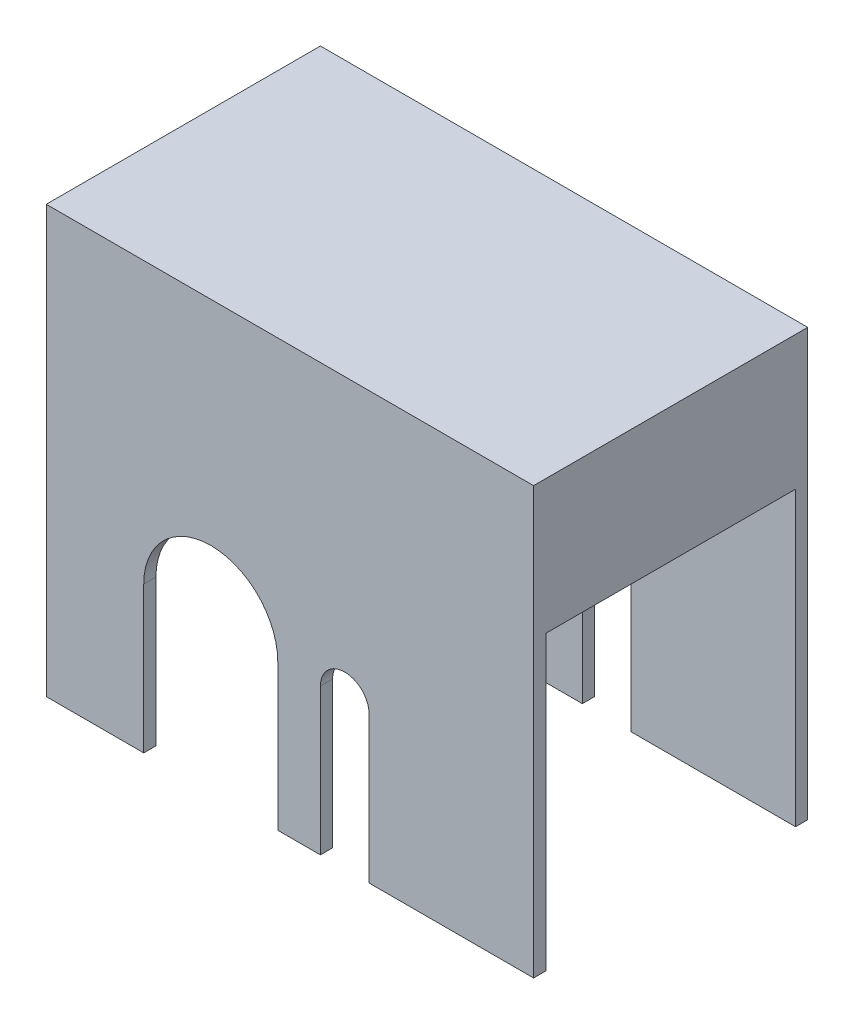
ISO-10303-21;
HEADER;
FILE_DESCRIPTION(('STEP AP214'),'2;1');
FILE_NAME('part.step','',(''),(''),'','','');
FILE_SCHEMA(('AUTOMOTIVE_DESIGN { 1 0 10303 214 1 1 1 1 }'));
ENDSEC;
DATA;
#1=APPLICATION_CONTEXT('core data for automotive mechanical design processes');
#2=APPLICATION_PROTOCOL_DEFINITION('international standard','automotive_design',2000,#1);
#3=PRODUCT_CONTEXT('',#1,'mechanical');
#4=PRODUCT('Part','Part','',(#3));
#5=PRODUCT_RELATED_PRODUCT_CATEGORY('part','',(#4));
#6=PRODUCT_DEFINITION_FORMATION('','',#4);
#7=PRODUCT_DEFINITION_CONTEXT('part definition',#1,'design');
#8=PRODUCT_DEFINITION('design','',#6,#7);
#9=PRODUCT_DEFINITION_SHAPE('','',#8);
#10=(LENGTH_UNIT() NAMED_UNIT(*) SI_UNIT(.MILLI.,.METRE.));
#11=(NAMED_UNIT(*) PLANE_ANGLE_UNIT() SI_UNIT($,.RADIAN.));
#12=(NAMED_UNIT(*) SI_UNIT($,.STERADIAN.) SOLID_ANGLE_UNIT());
#13=UNCERTAINTY_MEASURE_WITH_UNIT(LENGTH_MEASURE(1.E-05),#10,'distance_accuracy_value','');
#14=(GEOMETRIC_REPRESENTATION_CONTEXT(3) GLOBAL_UNCERTAINTY_ASSIGNED_CONTEXT((#13)) GLOBAL_UNIT_ASSIGNED_CONTEXT((#10,
#11,#12)) REPRESENTATION_CONTEXT('',''));
#15=CARTESIAN_POINT('',(0.,0.,0.));
#16=DIRECTION('',(0.,0.,1.));
#17=DIRECTION('',(1.,0.,0.));
#18=AXIS2_PLACEMENT_3D('',#15,#16,#17);
#19=CARTESIAN_POINT('',(0.,0.,0.));
#20=DIRECTION('',(0.,-1.,0.));
#21=DIRECTION('',(0.,0.,-1.));
#22=AXIS2_PLACEMENT_3D('',#19,#20,#21);
#23=PLANE('',#22);
#24=DIRECTION('',(-1.,0.,0.));
#25=VECTOR('',#24,1.);
#26=CARTESIAN_POINT('',(0.,0.,-19.0312952998344));
#27=LINE('',#26,#25);
#28=CARTESIAN_POINT('',(-3.99025919756967,0.,-19.0312952998344));
#29=VERTEX_POINT('',#28);
#30=CARTESIAN_POINT('',(-17.4902591975697,0.,-19.0312952998344));
#31=VERTEX_POINT('',#30);
#32=EDGE_CURVE('E300',#29,#31,#27,.T.);
#33=ORIENTED_EDGE('',*,*,#32,.T.);
#34=DIRECTION('',(0.,0.,1.));
#35=VECTOR('',#34,1.);
#36=CARTESIAN_POINT('',(-17.4902591975697,0.,-20.0313072998344));
#37=LINE('',#36,#35);
#38=CARTESIAN_POINT('',(-17.4902591975697,0.,-20.0312952998344));
#39=VERTEX_POINT('',#38);
#40=EDGE_CURVE('E399',#39,#31,#37,.T.);
#41=ORIENTED_EDGE('',*,*,#40,.F.);
#42=DIRECTION('',(-1.,0.,0.));
#43=VECTOR('',#42,1.);
#44=CARTESIAN_POINT('',(-43.9902591975697,0.,-20.0312952998344));
#45=LINE('',#44,#43);
#46=CARTESIAN_POINT('',(-3.99025919756967,0.,-20.0312952998344));
#47=VERTEX_POINT('',#46);
#48=EDGE_CURVE('E326',#47,#39,#45,.T.);
#49=ORIENTED_EDGE('',*,*,#48,.F.);
#50=DIRECTION('',(0.,0.,-1.));
#51=VECTOR('',#50,1.);
#52=CARTESIAN_POINT('',(-3.99025919756967,0.,-20.0312952998344));
#53=LINE('',#52,#51);
#54=EDGE_CURVE('E320',#29,#47,#53,.T.);
#55=ORIENTED_EDGE('',*,*,#54,.F.);
#56=EDGE_LOOP('',(#33,#41,#49,#55));
#57=FACE_BOUND('',#56,.T.);
#58=ADVANCED_FACE('F35',(#57),#23,.T.);
#59=CARTESIAN_POINT('',(-21.4902591975697,0.,-20.0312952998344));
#60=VERTEX_POINT('',#59);
#61=CARTESIAN_POINT('',(-24.9902591975697,0.,-20.0312952998344));
#62=VERTEX_POINT('',#61);
#63=EDGE_CURVE('E227',#60,#62,#45,.T.);
#64=ORIENTED_EDGE('',*,*,#63,.F.);
#65=DIRECTION('',(0.,0.,1.));
#66=VECTOR('',#65,1.);
#67=CARTESIAN_POINT('',(-21.4902591975697,0.,-20.0313072998344));
#68=LINE('',#67,#66);
#69=CARTESIAN_POINT('',(-21.4902591975697,0.,-19.0312952998344));
#70=VERTEX_POINT('',#69);
#71=EDGE_CURVE('E395',#60,#70,#68,.T.);
#72=ORIENTED_EDGE('',*,*,#71,.T.);
#73=CARTESIAN_POINT('',(-24.9902591975697,0.,-19.0312952998344));
#74=VERTEX_POINT('',#73);
#75=EDGE_CURVE('E306',#70,#74,#27,.T.);
#76=ORIENTED_EDGE('',*,*,#75,.T.);
#77=DIRECTION('',(0.,0.,1.));
#78=VECTOR('',#77,1.);
#79=CARTESIAN_POINT('',(-24.9902591975697,0.,-20.0313072998344));
#80=LINE('',#79,#78);
#81=EDGE_CURVE('E223',#62,#74,#80,.T.);
#82=ORIENTED_EDGE('',*,*,#81,.F.);
#83=EDGE_LOOP('',(#64,#72,#76,#82));
#84=FACE_BOUND('',#83,.T.);
#85=ADVANCED_FACE('F452',(#84),#23,.T.);
#86=CARTESIAN_POINT('',(-43.9902591975697,25.,-20.0312952998344));
#87=DIRECTION('',(0.,0.,1.));
#88=DIRECTION('',(1.,0.,0.));
#89=AXIS2_PLACEMENT_3D('',#86,#87,#88);
#90=PLANE('',#89);
#91=DIRECTION('',(0.,-1.,0.));
#92=VECTOR('',#91,1.);
#93=CARTESIAN_POINT('',(-17.4902591975697,25.,-20.0312952998344));
#94=LINE('',#93,#92);
#95=CARTESIAN_POINT('',(-17.4902591975697,12.,-20.0312952998344));
#96=VERTEX_POINT('',#95);
#97=EDGE_CURVE('E402',#96,#39,#94,.T.);
#98=ORIENTED_EDGE('',*,*,#97,.F.);
#99=CARTESIAN_POINT('',(-19.4902591975697,12.,-20.0312952998344));
#100=DIRECTION('',(0.,0.,-1.));
#101=DIRECTION('',(-1.,0.,0.));
#102=AXIS2_PLACEMENT_3D('',#99,#100,#101);
#103=CIRCLE('',#102,2.);
#104=CARTESIAN_POINT('',(-21.4902591975697,12.,-20.0312952998344));
#105=VERTEX_POINT('',#104);
#106=EDGE_CURVE('E39',#105,#96,#103,.T.);
#107=ORIENTED_EDGE('',*,*,#106,.F.);
#108=DIRECTION('',(0.,1.,0.));
#109=VECTOR('',#108,1.);
#110=CARTESIAN_POINT('',(-21.4902591975697,25.,-20.0312952998344));
#111=LINE('',#110,#109);
#112=EDGE_CURVE('E69',#60,#105,#111,.T.);
#113=ORIENTED_EDGE('',*,*,#112,.F.);
#114=ORIENTED_EDGE('',*,*,#63,.T.);
#115=DIRECTION('',(0.,-1.,0.));
#116=VECTOR('',#115,1.);
#117=CARTESIAN_POINT('',(-24.9902591975697,25.,-20.0312952998344));
#118=LINE('',#117,#116);
#119=CARTESIAN_POINT('',(-24.9902591975697,12.,-20.0312952998344));
#120=VERTEX_POINT('',#119);
#121=EDGE_CURVE('E209',#120,#62,#118,.T.);
#122=ORIENTED_EDGE('',*,*,#121,.F.);
#123=CARTESIAN_POINT('',(-30.4902591975697,12.,-20.0312952998344));
#124=DIRECTION('',(0.,0.,-1.));
#125=DIRECTION('',(-1.,0.,0.));
#126=AXIS2_PLACEMENT_3D('',#123,#124,#125);
#127=CIRCLE('',#126,5.5);
#128=CARTESIAN_POINT('',(-35.9902591975697,12.,-20.0312952998344));
#129=VERTEX_POINT('',#128);
#130=EDGE_CURVE('E220',#129,#120,#127,.T.);
#131=ORIENTED_EDGE('',*,*,#130,.F.);
#132=DIRECTION('',(0.,1.,0.));
#133=VECTOR('',#132,1.);
#134=CARTESIAN_POINT('',(-35.9902591975697,25.,-20.0312952998344));
#135=LINE('',#134,#133);
#136=CARTESIAN_POINT('',(-35.9902591975697,0.,-20.0312952998344));
#137=VERTEX_POINT('',#136);
#138=EDGE_CURVE('E198',#137,#129,#135,.T.);
#139=ORIENTED_EDGE('',*,*,#138,.F.);
#140=CARTESIAN_POINT('',(-43.9902591975697,0.,-20.0312952998344));
#141=VERTEX_POINT('',#140);
#142=EDGE_CURVE('E325',#137,#141,#45,.T.);
#143=ORIENTED_EDGE('',*,*,#142,.T.);
#144=DIRECTION('',(0.,-1.,0.));
#145=VECTOR('',#144,1.);
#146=CARTESIAN_POINT('',(-43.9902591975697,25.,-20.0312952998344));
#147=LINE('',#146,#145);
#148=CARTESIAN_POINT('',(-43.9902591975697,35.,-20.0312952998344));
#149=VERTEX_POINT('',#148);
#150=EDGE_CURVE('E329',#149,#141,#147,.T.);
#151=ORIENTED_EDGE('',*,*,#150,.F.);
#152=DIRECTION('',(-1.,0.,0.));
#153=VECTOR('',#152,1.);
#154=CARTESIAN_POINT('',(-3.99025919756967,35.,-20.0312952998344));
#155=LINE('',#154,#153);
#156=CARTESIAN_POINT('',(-3.99025919756967,35.,-20.0312952998344));
#157=VERTEX_POINT('',#156);
#158=EDGE_CURVE('E377',#157,#149,#155,.T.);
#159=ORIENTED_EDGE('',*,*,#158,.F.);
#160=DIRECTION('',(0.,-1.,0.));
#161=VECTOR('',#160,1.);
#162=CARTESIAN_POINT('',(-3.99025919756967,25.,-20.0312952998344));
#163=LINE('',#162,#161);
#164=EDGE_CURVE('E332',#157,#47,#163,.T.);
#165=ORIENTED_EDGE('',*,*,#164,.T.);
#166=ORIENTED_EDGE('',*,*,#48,.T.);
#167=EDGE_LOOP('',(#98,#107,#113,#114,#122,#131,#139,#143,#151,#159,#165,#166));
#168=FACE_BOUND('',#167,.T.);
#169=ADVANCED_FACE('F225',(#168),#90,.F.);
#170=CARTESIAN_POINT('',(-43.9902591975697,25.,-19.0312952998344));
#171=DIRECTION('',(0.,0.,1.));
#172=DIRECTION('',(1.,0.,0.));
#173=AXIS2_PLACEMENT_3D('',#170,#171,#172);
#174=PLANE('',#173);
#175=CARTESIAN_POINT('',(-19.4902591975697,12.,-19.0312952998344));
#176=DIRECTION('',(0.,0.,-1.));
#177=DIRECTION('',(-1.,0.,0.));
#178=AXIS2_PLACEMENT_3D('',#175,#176,#177);
#179=CIRCLE('',#178,2.);
#180=CARTESIAN_POINT('',(-21.4902591975697,12.,-19.0312952998344));
#181=VERTEX_POINT('',#180);
#182=CARTESIAN_POINT('',(-17.4902591975697,12.,-19.0312952998344));
#183=VERTEX_POINT('',#182);
#184=EDGE_CURVE('E386',#181,#183,#179,.T.);
#185=ORIENTED_EDGE('',*,*,#184,.T.);
#186=DIRECTION('',(0.,-1.,0.));
#187=VECTOR('',#186,1.);
#188=CARTESIAN_POINT('',(-17.4902591975697,12.,-19.0312952998344));
#189=LINE('',#188,#187);
#190=EDGE_CURVE('E54',#183,#31,#189,.T.);
#191=ORIENTED_EDGE('',*,*,#190,.T.);
#192=ORIENTED_EDGE('',*,*,#32,.F.);
#193=DIRECTION('',(0.,-1.,0.));
#194=VECTOR('',#193,1.);
#195=CARTESIAN_POINT('',(-3.99025919756967,25.,-19.0312952998344));
#196=LINE('',#195,#194);
#197=CARTESIAN_POINT('',(-3.99025919756967,24.,-19.0312952998344));
#198=VERTEX_POINT('',#197);
#199=EDGE_CURVE('E303',#198,#29,#196,.T.);
#200=ORIENTED_EDGE('',*,*,#199,.F.);
#201=DIRECTION('',(-1.,0.,0.));
#202=VECTOR('',#201,1.);
#203=CARTESIAN_POINT('',(0.,24.,-19.0312952998344));
#204=LINE('',#203,#202);
#205=CARTESIAN_POINT('',(-43.9902591975697,24.,-19.0312952998344));
#206=VERTEX_POINT('',#205);
#207=EDGE_CURVE('E285',#198,#206,#204,.T.);
#208=ORIENTED_EDGE('',*,*,#207,.T.);
#209=DIRECTION('',(0.,-1.,0.));
#210=VECTOR('',#209,1.);
#211=CARTESIAN_POINT('',(-43.9902591975697,25.,-19.0312952998344));
#212=LINE('',#211,#210);
#213=CARTESIAN_POINT('',(-43.9902591975697,0.,-19.0312952998344));
#214=VERTEX_POINT('',#213);
#215=EDGE_CURVE('E287',#206,#214,#212,.T.);
#216=ORIENTED_EDGE('',*,*,#215,.T.);
#217=CARTESIAN_POINT('',(-35.9902591975697,0.,-19.0312952998344));
#218=VERTEX_POINT('',#217);
#219=EDGE_CURVE('E291',#218,#214,#27,.T.);
#220=ORIENTED_EDGE('',*,*,#219,.F.);
#221=DIRECTION('',(0.,1.,0.));
#222=VECTOR('',#221,1.);
#223=CARTESIAN_POINT('',(-35.9902591975697,12.,-19.0312952998344));
#224=LINE('',#223,#222);
#225=CARTESIAN_POINT('',(-35.9902591975697,12.,-19.0312952998344));
#226=VERTEX_POINT('',#225);
#227=EDGE_CURVE('E217',#218,#226,#224,.T.);
#228=ORIENTED_EDGE('',*,*,#227,.T.);
#229=CARTESIAN_POINT('',(-30.4902591975697,12.,-19.0312952998344));
#230=DIRECTION('',(0.,0.,-1.));
#231=DIRECTION('',(-1.,0.,0.));
#232=AXIS2_PLACEMENT_3D('',#229,#230,#231);
#233=CIRCLE('',#232,5.5);
#234=CARTESIAN_POINT('',(-24.9902591975697,12.,-19.0312952998344));
#235=VERTEX_POINT('',#234);
#236=EDGE_CURVE('E404',#226,#235,#233,.T.);
#237=ORIENTED_EDGE('',*,*,#236,.T.);
#238=DIRECTION('',(0.,-1.,0.));
#239=VECTOR('',#238,1.);
#240=CARTESIAN_POINT('',(-24.9902591975697,0.,-19.0312952998344));
#241=LINE('',#240,#239);
#242=EDGE_CURVE('E212',#235,#74,#241,.T.);
#243=ORIENTED_EDGE('',*,*,#242,.T.);
#244=ORIENTED_EDGE('',*,*,#75,.F.);
#245=DIRECTION('',(0.,1.,0.));
#246=VECTOR('',#245,1.);
#247=CARTESIAN_POINT('',(-21.4902591975697,12.,-19.0312952998344));
#248=LINE('',#247,#246);
#249=EDGE_CURVE('E390',#70,#181,#248,.T.);
#250=ORIENTED_EDGE('',*,*,#249,.T.);
#251=EDGE_LOOP('',(#185,#191,#192,#200,#208,#216,#220,#228,#237,#243,#244,#250));
#252=FACE_BOUND('',#251,.T.);
#253=ADVANCED_FACE('F415',(#252),#174,.T.);
#254=ORIENTED_EDGE('',*,*,#142,.F.);
#255=DIRECTION('',(0.,0.,1.));
#256=VECTOR('',#255,1.);
#257=CARTESIAN_POINT('',(-35.9902591975697,0.,-20.0313072998344));
#258=LINE('',#257,#256);
#259=EDGE_CURVE('E409',#137,#218,#258,.T.);
#260=ORIENTED_EDGE('',*,*,#259,.T.);
#261=ORIENTED_EDGE('',*,*,#219,.T.);
#262=DIRECTION('',(0.,0.,1.));
#263=VECTOR('',#262,1.);
#264=CARTESIAN_POINT('',(-43.9902591975697,0.,2.4687047001656));
#265=LINE('',#264,#263);
#266=EDGE_CURVE('E313',#141,#214,#265,.T.);
#267=ORIENTED_EDGE('',*,*,#266,.F.);
#268=EDGE_LOOP('',(#254,#260,#261,#267));
#269=FACE_BOUND('',#268,.T.);
#270=ADVANCED_FACE('F420',(#269),#23,.T.);
#271=DIRECTION('',(1.,0.,0.));
#272=VECTOR('',#271,1.);
#273=CARTESIAN_POINT('',(0.,0.,1.46870470016559));
#274=LINE('',#273,#272);
#275=CARTESIAN_POINT('',(-24.9902591975697,0.,1.46870470016559));
#276=VERTEX_POINT('',#275);
#277=CARTESIAN_POINT('',(-21.4902591975697,0.,1.46870470016559));
#278=VERTEX_POINT('',#277);
#279=EDGE_CURVE('E292',#276,#278,#274,.T.);
#280=ORIENTED_EDGE('',*,*,#279,.T.);
#281=DIRECTION('',(0.,0.,-1.));
#282=VECTOR('',#281,1.);
#283=CARTESIAN_POINT('',(-21.4902591975697,0.,2.46871670016559));
#284=LINE('',#283,#282);
#285=CARTESIAN_POINT('',(-21.4902591975697,0.,2.4687047001656));
#286=VERTEX_POINT('',#285);
#287=EDGE_CURVE('E249',#286,#278,#284,.T.);
#288=ORIENTED_EDGE('',*,*,#287,.F.);
#289=DIRECTION('',(1.,0.,0.));
#290=VECTOR('',#289,1.);
#291=CARTESIAN_POINT('',(-3.99025919756967,0.,2.4687047001656));
#292=LINE('',#291,#290);
#293=CARTESIAN_POINT('',(-24.9902591975697,0.,2.4687047001656));
#294=VERTEX_POINT('',#293);
#295=EDGE_CURVE('E321',#294,#286,#292,.T.);
#296=ORIENTED_EDGE('',*,*,#295,.F.);
#297=DIRECTION('',(0.,0.,-1.));
#298=VECTOR('',#297,1.);
#299=CARTESIAN_POINT('',(-24.9902591975697,0.,2.46871670016559));
#300=LINE('',#299,#298);
#301=EDGE_CURVE('E269',#294,#276,#300,.T.);
#302=ORIENTED_EDGE('',*,*,#301,.T.);
#303=EDGE_LOOP('',(#280,#288,#296,#302));
#304=FACE_BOUND('',#303,.T.);
#305=ADVANCED_FACE('F355',(#304),#23,.T.);
#306=CARTESIAN_POINT('',(-17.4902591975697,0.,2.4687047001656));
#307=VERTEX_POINT('',#306);
#308=CARTESIAN_POINT('',(-3.99025919756967,0.,2.4687047001656));
#309=VERTEX_POINT('',#308);
#310=EDGE_CURVE('E316',#307,#309,#292,.T.);
#311=ORIENTED_EDGE('',*,*,#310,.F.);
#312=DIRECTION('',(0.,0.,-1.));
#313=VECTOR('',#312,1.);
#314=CARTESIAN_POINT('',(-17.4902591975697,0.,2.46871670016559));
#315=LINE('',#314,#313);
#316=CARTESIAN_POINT('',(-17.4902591975697,0.,1.46870470016559));
#317=VERTEX_POINT('',#316);
#318=EDGE_CURVE('E245',#307,#317,#315,.T.);
#319=ORIENTED_EDGE('',*,*,#318,.T.);
#320=CARTESIAN_POINT('',(-3.99025919756967,0.,1.46870470016559));
#321=VERTEX_POINT('',#320);
#322=EDGE_CURVE('E280',#317,#321,#274,.T.);
#323=ORIENTED_EDGE('',*,*,#322,.T.);
#324=EDGE_CURVE('E322',#309,#321,#53,.T.);
#325=ORIENTED_EDGE('',*,*,#324,.F.);
#326=EDGE_LOOP('',(#311,#319,#323,#325));
#327=FACE_BOUND('',#326,.T.);
#328=ADVANCED_FACE('F362',(#327),#23,.T.);
#329=CARTESIAN_POINT('',(-3.99025919756967,25.,2.4687047001656));
#330=DIRECTION('',(0.,0.,-1.));
#331=DIRECTION('',(-1.,0.,0.));
#332=AXIS2_PLACEMENT_3D('',#329,#330,#331);
#333=PLANE('',#332);
#334=DIRECTION('',(0.,-1.,0.));
#335=VECTOR('',#334,1.);
#336=CARTESIAN_POINT('',(-21.4902591975697,25.,2.4687047001656));
#337=LINE('',#336,#335);
#338=CARTESIAN_POINT('',(-21.4902591975697,12.,2.4687047001656));
#339=VERTEX_POINT('',#338);
#340=EDGE_CURVE('E254',#339,#286,#337,.T.);
#341=ORIENTED_EDGE('',*,*,#340,.F.);
#342=CARTESIAN_POINT('',(-19.4902591975697,12.,2.4687047001656));
#343=DIRECTION('',(0.,0.,1.));
#344=DIRECTION('',(1.,0.,0.));
#345=AXIS2_PLACEMENT_3D('',#342,#343,#344);
#346=CIRCLE('',#345,2.);
#347=CARTESIAN_POINT('',(-17.4902591975697,12.,2.4687047001656));
#348=VERTEX_POINT('',#347);
#349=EDGE_CURVE('E251',#348,#339,#346,.T.);
#350=ORIENTED_EDGE('',*,*,#349,.F.);
#351=DIRECTION('',(0.,1.,0.));
#352=VECTOR('',#351,1.);
#353=CARTESIAN_POINT('',(-17.4902591975697,25.,2.4687047001656));
#354=LINE('',#353,#352);
#355=EDGE_CURVE('E252',#307,#348,#354,.T.);
#356=ORIENTED_EDGE('',*,*,#355,.F.);
#357=ORIENTED_EDGE('',*,*,#310,.T.);
#358=DIRECTION('',(0.,-1.,0.));
#359=VECTOR('',#358,1.);
#360=CARTESIAN_POINT('',(-3.99025919756967,25.,2.4687047001656));
#361=LINE('',#360,#359);
#362=CARTESIAN_POINT('',(-3.99025919756967,35.,2.4687047001656));
#363=VERTEX_POINT('',#362);
#364=EDGE_CURVE('E45',#363,#309,#361,.T.);
#365=ORIENTED_EDGE('',*,*,#364,.F.);
#366=DIRECTION('',(1.,0.,0.));
#367=VECTOR('',#366,1.);
#368=CARTESIAN_POINT('',(-43.9902591975697,35.,2.4687047001656));
#369=LINE('',#368,#367);
#370=CARTESIAN_POINT('',(-43.9902591975697,35.,2.4687047001656));
#371=VERTEX_POINT('',#370);
#372=EDGE_CURVE('E384',#371,#363,#369,.T.);
#373=ORIENTED_EDGE('',*,*,#372,.F.);
#374=DIRECTION('',(0.,-1.,0.));
#375=VECTOR('',#374,1.);
#376=CARTESIAN_POINT('',(-43.9902591975697,25.,2.4687047001656));
#377=LINE('',#376,#375);
#378=CARTESIAN_POINT('',(-43.9902591975697,0.,2.4687047001656));
#379=VERTEX_POINT('',#378);
#380=EDGE_CURVE('E11',#371,#379,#377,.T.);
#381=ORIENTED_EDGE('',*,*,#380,.T.);
#382=CARTESIAN_POINT('',(-35.9902591975697,0.,2.4687047001656));
#383=VERTEX_POINT('',#382);
#384=EDGE_CURVE('E317',#379,#383,#292,.T.);
#385=ORIENTED_EDGE('',*,*,#384,.T.);
#386=DIRECTION('',(0.,-1.,0.));
#387=VECTOR('',#386,1.);
#388=CARTESIAN_POINT('',(-35.9902591975697,25.,2.4687047001656));
#389=LINE('',#388,#387);
#390=CARTESIAN_POINT('',(-35.9902591975697,12.,2.4687047001656));
#391=VERTEX_POINT('',#390);
#392=EDGE_CURVE('E278',#391,#383,#389,.T.);
#393=ORIENTED_EDGE('',*,*,#392,.F.);
#394=CARTESIAN_POINT('',(-30.4902591975697,12.,2.4687047001656));
#395=DIRECTION('',(0.,0.,1.));
#396=DIRECTION('',(1.,0.,0.));
#397=AXIS2_PLACEMENT_3D('',#394,#395,#396);
#398=CIRCLE('',#397,5.5);
#399=CARTESIAN_POINT('',(-24.9902591975697,12.,2.4687047001656));
#400=VERTEX_POINT('',#399);
#401=EDGE_CURVE('E275',#400,#391,#398,.T.);
#402=ORIENTED_EDGE('',*,*,#401,.F.);
#403=DIRECTION('',(0.,1.,0.));
#404=VECTOR('',#403,1.);
#405=CARTESIAN_POINT('',(-24.9902591975697,25.,2.4687047001656));
#406=LINE('',#405,#404);
#407=EDGE_CURVE('E276',#294,#400,#406,.T.);
#408=ORIENTED_EDGE('',*,*,#407,.F.);
#409=ORIENTED_EDGE('',*,*,#295,.T.);
#410=EDGE_LOOP('',(#341,#350,#356,#357,#365,#373,#381,#385,#393,#402,#408,#409));
#411=FACE_BOUND('',#410,.T.);
#412=ADVANCED_FACE('F347',(#411),#333,.F.);
#413=CARTESIAN_POINT('',(-3.99025919756967,25.,1.4687047001656));
#414=DIRECTION('',(0.,0.,-1.));
#415=DIRECTION('',(-1.,0.,0.));
#416=AXIS2_PLACEMENT_3D('',#413,#414,#415);
#417=PLANE('',#416);
#418=CARTESIAN_POINT('',(-19.4902591975697,12.,1.46870470016559));
#419=DIRECTION('',(0.,0.,1.));
#420=DIRECTION('',(1.,0.,0.));
#421=AXIS2_PLACEMENT_3D('',#418,#419,#420);
#422=CIRCLE('',#421,2.);
#423=CARTESIAN_POINT('',(-17.4902591975697,12.,1.46870470016559));
#424=VERTEX_POINT('',#423);
#425=CARTESIAN_POINT('',(-21.4902591975697,12.,1.4687047001656));
#426=VERTEX_POINT('',#425);
#427=EDGE_CURVE('E228',#424,#426,#422,.T.);
#428=ORIENTED_EDGE('',*,*,#427,.T.);
#429=DIRECTION('',(0.,-1.,0.));
#430=VECTOR('',#429,1.);
#431=CARTESIAN_POINT('',(-21.4902591975697,12.,1.46870470016559));
#432=LINE('',#431,#430);
#433=EDGE_CURVE('E231',#426,#278,#432,.T.);
#434=ORIENTED_EDGE('',*,*,#433,.T.);
#435=ORIENTED_EDGE('',*,*,#279,.F.);
#436=DIRECTION('',(0.,1.,0.));
#437=VECTOR('',#436,1.);
#438=CARTESIAN_POINT('',(-24.9902591975697,12.,1.46870470016559));
#439=LINE('',#438,#437);
#440=CARTESIAN_POINT('',(-24.9902591975697,12.,1.46870470016559));
#441=VERTEX_POINT('',#440);
#442=EDGE_CURVE('E262',#276,#441,#439,.T.);
#443=ORIENTED_EDGE('',*,*,#442,.T.);
#444=CARTESIAN_POINT('',(-30.4902591975697,12.,1.46870470016559));
#445=DIRECTION('',(0.,0.,1.));
#446=DIRECTION('',(1.,0.,0.));
#447=AXIS2_PLACEMENT_3D('',#444,#445,#446);
#448=CIRCLE('',#447,5.5);
#449=CARTESIAN_POINT('',(-35.9902591975697,12.,1.4687047001656));
#450=VERTEX_POINT('',#449);
#451=EDGE_CURVE('E256',#441,#450,#448,.T.);
#452=ORIENTED_EDGE('',*,*,#451,.T.);
#453=DIRECTION('',(0.,-1.,0.));
#454=VECTOR('',#453,1.);
#455=CARTESIAN_POINT('',(-35.9902591975697,12.,1.46870470016559));
#456=LINE('',#455,#454);
#457=CARTESIAN_POINT('',(-35.9902591975697,0.,1.46870470016559));
#458=VERTEX_POINT('',#457);
#459=EDGE_CURVE('E259',#450,#458,#456,.T.);
#460=ORIENTED_EDGE('',*,*,#459,.T.);
#461=CARTESIAN_POINT('',(-43.9902591975697,0.,1.4687047001656));
#462=VERTEX_POINT('',#461);
#463=EDGE_CURVE('E288',#462,#458,#274,.T.);
#464=ORIENTED_EDGE('',*,*,#463,.F.);
#465=DIRECTION('',(0.,-1.,0.));
#466=VECTOR('',#465,1.);
#467=CARTESIAN_POINT('',(-43.9902591975697,25.,1.4687047001656));
#468=LINE('',#467,#466);
#469=CARTESIAN_POINT('',(-43.9902591975697,24.,1.4687047001656));
#470=VERTEX_POINT('',#469);
#471=EDGE_CURVE('E293',#470,#462,#468,.T.);
#472=ORIENTED_EDGE('',*,*,#471,.F.);
#473=DIRECTION('',(1.,0.,0.));
#474=VECTOR('',#473,1.);
#475=CARTESIAN_POINT('',(0.,24.,1.46870470016559));
#476=LINE('',#475,#474);
#477=CARTESIAN_POINT('',(-3.99025919756967,24.,1.4687047001656));
#478=VERTEX_POINT('',#477);
#479=EDGE_CURVE('E281',#470,#478,#476,.T.);
#480=ORIENTED_EDGE('',*,*,#479,.T.);
#481=DIRECTION('',(0.,-1.,0.));
#482=VECTOR('',#481,1.);
#483=CARTESIAN_POINT('',(-3.99025919756967,25.,1.46870470016559));
#484=LINE('',#483,#482);
#485=EDGE_CURVE('E297',#478,#321,#484,.T.);
#486=ORIENTED_EDGE('',*,*,#485,.T.);
#487=ORIENTED_EDGE('',*,*,#322,.F.);
#488=DIRECTION('',(0.,1.,0.));
#489=VECTOR('',#488,1.);
#490=CARTESIAN_POINT('',(-17.4902591975697,12.,1.46870470016559));
#491=LINE('',#490,#489);
#492=EDGE_CURVE('E238',#317,#424,#491,.T.);
#493=ORIENTED_EDGE('',*,*,#492,.T.);
#494=EDGE_LOOP('',(#428,#434,#435,#443,#452,#460,#464,#472,#480,#486,#487,#493));
#495=FACE_BOUND('',#494,.T.);
#496=ADVANCED_FACE('F364',(#495),#417,.T.);
#497=ORIENTED_EDGE('',*,*,#463,.T.);
#498=DIRECTION('',(0.,0.,-1.));
#499=VECTOR('',#498,1.);
#500=CARTESIAN_POINT('',(-35.9902591975697,0.,2.46871670016559));
#501=LINE('',#500,#499);
#502=EDGE_CURVE('E273',#383,#458,#501,.T.);
#503=ORIENTED_EDGE('',*,*,#502,.F.);
#504=ORIENTED_EDGE('',*,*,#384,.F.);
#505=EDGE_CURVE('E296',#462,#379,#265,.T.);
#506=ORIENTED_EDGE('',*,*,#505,.F.);
#507=EDGE_LOOP('',(#497,#503,#504,#506));
#508=FACE_BOUND('',#507,.T.);
#509=ADVANCED_FACE('F433',(#508),#23,.T.);
#510=CARTESIAN_POINT('',(-43.9902591975697,25.,2.4687047001656));
#511=DIRECTION('',(1.,0.,0.));
#512=DIRECTION('',(0.,0.,-1.));
#513=AXIS2_PLACEMENT_3D('',#510,#511,#512);
#514=PLANE('',#513);
#515=DIRECTION('',(0.,0.,1.));
#516=VECTOR('',#515,1.);
#517=CARTESIAN_POINT('',(-43.9902591975697,24.,0.));
#518=LINE('',#517,#516);
#519=EDGE_CURVE('E284',#206,#470,#518,.T.);
#520=ORIENTED_EDGE('',*,*,#519,.T.);
#521=ORIENTED_EDGE('',*,*,#471,.T.);
#522=ORIENTED_EDGE('',*,*,#505,.T.);
#523=ORIENTED_EDGE('',*,*,#380,.F.);
#524=DIRECTION('',(0.,0.,1.));
#525=VECTOR('',#524,1.);
#526=CARTESIAN_POINT('',(-43.9902591975697,35.,-20.0312952998344));
#527=LINE('',#526,#525);
#528=EDGE_CURVE('E379',#149,#371,#527,.T.);
#529=ORIENTED_EDGE('',*,*,#528,.F.);
#530=ORIENTED_EDGE('',*,*,#150,.T.);
#531=ORIENTED_EDGE('',*,*,#266,.T.);
#532=ORIENTED_EDGE('',*,*,#215,.F.);
#533=EDGE_LOOP('',(#520,#521,#522,#523,#529,#530,#531,#532));
#534=FACE_BOUND('',#533,.T.);
#535=ADVANCED_FACE('F37',(#534),#514,.F.);
#536=CARTESIAN_POINT('',(-3.99025919756967,25.,-20.0312952998344));
#537=DIRECTION('',(-1.,0.,0.));
#538=DIRECTION('',(0.,0.,1.));
#539=AXIS2_PLACEMENT_3D('',#536,#537,#538);
#540=PLANE('',#539);
#541=DIRECTION('',(0.,0.,-1.));
#542=VECTOR('',#541,1.);
#543=CARTESIAN_POINT('',(-3.99025919756967,24.,0.));
#544=LINE('',#543,#542);
#545=EDGE_CURVE('E283',#478,#198,#544,.T.);
#546=ORIENTED_EDGE('',*,*,#545,.T.);
#547=ORIENTED_EDGE('',*,*,#199,.T.);
#548=ORIENTED_EDGE('',*,*,#54,.T.);
#549=ORIENTED_EDGE('',*,*,#164,.F.);
#550=DIRECTION('',(0.,0.,-1.));
#551=VECTOR('',#550,1.);
#552=CARTESIAN_POINT('',(-3.99025919756967,35.,2.4687047001656));
#553=LINE('',#552,#551);
#554=EDGE_CURVE('E372',#363,#157,#553,.T.);
#555=ORIENTED_EDGE('',*,*,#554,.F.);
#556=ORIENTED_EDGE('',*,*,#364,.T.);
#557=ORIENTED_EDGE('',*,*,#324,.T.);
#558=ORIENTED_EDGE('',*,*,#485,.F.);
#559=EDGE_LOOP('',(#546,#547,#548,#549,#555,#556,#557,#558));
#560=FACE_BOUND('',#559,.T.);
#561=ADVANCED_FACE('F368',(#560),#540,.F.);
#562=CARTESIAN_POINT('',(0.,24.,0.));
#563=DIRECTION('',(0.,-1.,0.));
#564=DIRECTION('',(0.,0.,-1.));
#565=AXIS2_PLACEMENT_3D('',#562,#563,#564);
#566=PLANE('',#565);
#567=ORIENTED_EDGE('',*,*,#519,.F.);
#568=ORIENTED_EDGE('',*,*,#207,.F.);
#569=ORIENTED_EDGE('',*,*,#545,.F.);
#570=ORIENTED_EDGE('',*,*,#479,.F.);
#571=EDGE_LOOP('',(#567,#568,#569,#570));
#572=FACE_BOUND('',#571,.T.);
#573=ADVANCED_FACE('F449',(#572),#566,.T.);
#574=CARTESIAN_POINT('',(-35.9902591975697,12.,2.46871670016559));
#575=DIRECTION('',(1.,0.,0.));
#576=DIRECTION('',(0.,0.,-1.));
#577=AXIS2_PLACEMENT_3D('',#574,#575,#576);
#578=PLANE('',#577);
#579=ORIENTED_EDGE('',*,*,#392,.T.);
#580=ORIENTED_EDGE('',*,*,#502,.T.);
#581=ORIENTED_EDGE('',*,*,#459,.F.);
#582=DIRECTION('',(0.,0.,1.));
#583=VECTOR('',#582,1.);
#584=CARTESIAN_POINT('',(-35.9902591975697,12.,1.46870470016559));
#585=LINE('',#584,#583);
#586=EDGE_CURVE('E265',#450,#391,#585,.T.);
#587=ORIENTED_EDGE('',*,*,#586,.T.);
#588=EDGE_LOOP('',(#579,#580,#581,#587));
#589=FACE_BOUND('',#588,.T.);
#590=ADVANCED_FACE('F435',(#589),#578,.T.);
#591=CARTESIAN_POINT('',(-24.9902591975697,12.,2.46871670016559));
#592=DIRECTION('',(-1.,0.,0.));
#593=DIRECTION('',(0.,-1.,0.));
#594=AXIS2_PLACEMENT_3D('',#591,#592,#593);
#595=PLANE('',#594);
#596=ORIENTED_EDGE('',*,*,#407,.T.);
#597=DIRECTION('',(0.,0.,1.));
#598=VECTOR('',#597,1.);
#599=CARTESIAN_POINT('',(-24.9902591975697,12.,1.46870470016559));
#600=LINE('',#599,#598);
#601=EDGE_CURVE('E266',#441,#400,#600,.T.);
#602=ORIENTED_EDGE('',*,*,#601,.F.);
#603=ORIENTED_EDGE('',*,*,#442,.F.);
#604=ORIENTED_EDGE('',*,*,#301,.F.);
#605=EDGE_LOOP('',(#596,#602,#603,#604));
#606=FACE_BOUND('',#605,.T.);
#607=ADVANCED_FACE('F441',(#606),#595,.T.);
#608=CARTESIAN_POINT('',(-30.4902591975697,12.,1.46870470016559));
#609=DIRECTION('',(0.,0.,1.));
#610=DIRECTION('',(1.,0.,0.));
#611=AXIS2_PLACEMENT_3D('',#608,#609,#610);
#612=CYLINDRICAL_SURFACE('',#611,5.5);
#613=ORIENTED_EDGE('',*,*,#586,.F.);
#614=ORIENTED_EDGE('',*,*,#451,.F.);
#615=ORIENTED_EDGE('',*,*,#601,.T.);
#616=ORIENTED_EDGE('',*,*,#401,.T.);
#617=EDGE_LOOP('',(#613,#614,#615,#616));
#618=FACE_BOUND('',#617,.T.);
#619=ADVANCED_FACE('F439',(#618),#612,.F.);
#620=CARTESIAN_POINT('',(-21.4902591975697,12.,2.46871670016559));
#621=DIRECTION('',(1.,0.,0.));
#622=DIRECTION('',(0.,1.,0.));
#623=AXIS2_PLACEMENT_3D('',#620,#621,#622);
#624=PLANE('',#623);
#625=ORIENTED_EDGE('',*,*,#340,.T.);
#626=ORIENTED_EDGE('',*,*,#287,.T.);
#627=ORIENTED_EDGE('',*,*,#433,.F.);
#628=DIRECTION('',(0.,0.,1.));
#629=VECTOR('',#628,1.);
#630=CARTESIAN_POINT('',(-21.4902591975697,12.,1.46870470016559));
#631=LINE('',#630,#629);
#632=EDGE_CURVE('E241',#426,#339,#631,.T.);
#633=ORIENTED_EDGE('',*,*,#632,.T.);
#634=EDGE_LOOP('',(#625,#626,#627,#633));
#635=FACE_BOUND('',#634,.T.);
#636=ADVANCED_FACE('F352',(#635),#624,.T.);
#637=CARTESIAN_POINT('',(-17.4902591975697,12.,2.46871670016559));
#638=DIRECTION('',(-1.,0.,0.));
#639=DIRECTION('',(0.,-1.,0.));
#640=AXIS2_PLACEMENT_3D('',#637,#638,#639);
#641=PLANE('',#640);
#642=ORIENTED_EDGE('',*,*,#355,.T.);
#643=DIRECTION('',(0.,0.,1.));
#644=VECTOR('',#643,1.);
#645=CARTESIAN_POINT('',(-17.4902591975697,12.,1.46870470016559));
#646=LINE('',#645,#644);
#647=EDGE_CURVE('E242',#424,#348,#646,.T.);
#648=ORIENTED_EDGE('',*,*,#647,.F.);
#649=ORIENTED_EDGE('',*,*,#492,.F.);
#650=ORIENTED_EDGE('',*,*,#318,.F.);
#651=EDGE_LOOP('',(#642,#648,#649,#650));
#652=FACE_BOUND('',#651,.T.);
#653=ADVANCED_FACE('F517',(#652),#641,.T.);
#654=CARTESIAN_POINT('',(-19.4902591975697,12.,1.46870470016559));
#655=DIRECTION('',(0.,0.,1.));
#656=DIRECTION('',(1.,0.,0.));
#657=AXIS2_PLACEMENT_3D('',#654,#655,#656);
#658=CYLINDRICAL_SURFACE('',#657,2.);
#659=ORIENTED_EDGE('',*,*,#632,.F.);
#660=ORIENTED_EDGE('',*,*,#427,.F.);
#661=ORIENTED_EDGE('',*,*,#647,.T.);
#662=ORIENTED_EDGE('',*,*,#349,.T.);
#663=EDGE_LOOP('',(#659,#660,#661,#662));
#664=FACE_BOUND('',#663,.T.);
#665=ADVANCED_FACE('F343',(#664),#658,.F.);
#666=CARTESIAN_POINT('',(-24.9902591975697,0.,-20.0313072998344));
#667=DIRECTION('',(-1.,0.,0.));
#668=DIRECTION('',(0.,0.,1.));
#669=AXIS2_PLACEMENT_3D('',#666,#667,#668);
#670=PLANE('',#669);
#671=ORIENTED_EDGE('',*,*,#121,.T.);
#672=ORIENTED_EDGE('',*,*,#81,.T.);
#673=ORIENTED_EDGE('',*,*,#242,.F.);
#674=DIRECTION('',(0.,0.,-1.));
#675=VECTOR('',#674,1.);
#676=CARTESIAN_POINT('',(-24.9902591975697,12.,-19.0312952998344));
#677=LINE('',#676,#675);
#678=EDGE_CURVE('E204',#235,#120,#677,.T.);
#679=ORIENTED_EDGE('',*,*,#678,.T.);
#680=EDGE_LOOP('',(#671,#672,#673,#679));
#681=FACE_BOUND('',#680,.T.);
#682=ADVANCED_FACE('F206',(#681),#670,.T.);
#683=CARTESIAN_POINT('',(-35.9902591975697,12.,-20.0313072998344));
#684=DIRECTION('',(1.,0.,0.));
#685=DIRECTION('',(0.,0.,-1.));
#686=AXIS2_PLACEMENT_3D('',#683,#684,#685);
#687=PLANE('',#686);
#688=ORIENTED_EDGE('',*,*,#138,.T.);
#689=DIRECTION('',(0.,0.,-1.));
#690=VECTOR('',#689,1.);
#691=CARTESIAN_POINT('',(-35.9902591975697,12.,-19.0312952998344));
#692=LINE('',#691,#690);
#693=EDGE_CURVE('E216',#226,#129,#692,.T.);
#694=ORIENTED_EDGE('',*,*,#693,.F.);
#695=ORIENTED_EDGE('',*,*,#227,.F.);
#696=ORIENTED_EDGE('',*,*,#259,.F.);
#697=EDGE_LOOP('',(#688,#694,#695,#696));
#698=FACE_BOUND('',#697,.T.);
#699=ADVANCED_FACE('F417',(#698),#687,.T.);
#700=CARTESIAN_POINT('',(-30.4902591975697,12.,-19.0312952998344));
#701=DIRECTION('',(0.,0.,-1.));
#702=DIRECTION('',(-1.,0.,0.));
#703=AXIS2_PLACEMENT_3D('',#700,#701,#702);
#704=CYLINDRICAL_SURFACE('',#703,5.5);
#705=ORIENTED_EDGE('',*,*,#678,.F.);
#706=ORIENTED_EDGE('',*,*,#236,.F.);
#707=ORIENTED_EDGE('',*,*,#693,.T.);
#708=ORIENTED_EDGE('',*,*,#130,.T.);
#709=EDGE_LOOP('',(#705,#706,#707,#708));
#710=FACE_BOUND('',#709,.T.);
#711=ADVANCED_FACE('F221',(#710),#704,.F.);
#712=CARTESIAN_POINT('',(-17.4902591975697,12.,-20.0313072998344));
#713=DIRECTION('',(-1.,0.,0.));
#714=DIRECTION('',(0.,-1.,0.));
#715=AXIS2_PLACEMENT_3D('',#712,#713,#714);
#716=PLANE('',#715);
#717=ORIENTED_EDGE('',*,*,#97,.T.);
#718=ORIENTED_EDGE('',*,*,#40,.T.);
#719=ORIENTED_EDGE('',*,*,#190,.F.);
#720=DIRECTION('',(0.,0.,-1.));
#721=VECTOR('',#720,1.);
#722=CARTESIAN_POINT('',(-17.4902591975697,12.,-19.0312952998344));
#723=LINE('',#722,#721);
#724=EDGE_CURVE('E75',#183,#96,#723,.T.);
#725=ORIENTED_EDGE('',*,*,#724,.T.);
#726=EDGE_LOOP('',(#717,#718,#719,#725));
#727=FACE_BOUND('',#726,.T.);
#728=ADVANCED_FACE('F494',(#727),#716,.T.);
#729=CARTESIAN_POINT('',(-21.4902591975697,12.,-20.0313072998344));
#730=DIRECTION('',(1.,0.,0.));
#731=DIRECTION('',(0.,1.,0.));
#732=AXIS2_PLACEMENT_3D('',#729,#730,#731);
#733=PLANE('',#732);
#734=ORIENTED_EDGE('',*,*,#112,.T.);
#735=DIRECTION('',(0.,0.,-1.));
#736=VECTOR('',#735,1.);
#737=CARTESIAN_POINT('',(-21.4902591975697,12.,-19.0312952998344));
#738=LINE('',#737,#736);
#739=EDGE_CURVE('E393',#181,#105,#738,.T.);
#740=ORIENTED_EDGE('',*,*,#739,.F.);
#741=ORIENTED_EDGE('',*,*,#249,.F.);
#742=ORIENTED_EDGE('',*,*,#71,.F.);
#743=EDGE_LOOP('',(#734,#740,#741,#742));
#744=FACE_BOUND('',#743,.T.);
#745=ADVANCED_FACE('F498',(#744),#733,.T.);
#746=CARTESIAN_POINT('',(-19.4902591975697,12.,-19.0312952998344));
#747=DIRECTION('',(0.,0.,-1.));
#748=DIRECTION('',(-1.,0.,0.));
#749=AXIS2_PLACEMENT_3D('',#746,#747,#748);
#750=CYLINDRICAL_SURFACE('',#749,2.);
#751=ORIENTED_EDGE('',*,*,#724,.F.);
#752=ORIENTED_EDGE('',*,*,#184,.F.);
#753=ORIENTED_EDGE('',*,*,#739,.T.);
#754=ORIENTED_EDGE('',*,*,#106,.T.);
#755=EDGE_LOOP('',(#751,#752,#753,#754));
#756=FACE_BOUND('',#755,.T.);
#757=ADVANCED_FACE('F497',(#756),#750,.F.);
#758=CARTESIAN_POINT('',(0.,35.,0.));
#759=DIRECTION('',(0.,1.,0.));
#760=DIRECTION('',(0.,0.,1.));
#761=AXIS2_PLACEMENT_3D('',#758,#759,#760);
#762=PLANE('',#761);
#763=ORIENTED_EDGE('',*,*,#554,.T.);
#764=ORIENTED_EDGE('',*,*,#158,.T.);
#765=ORIENTED_EDGE('',*,*,#528,.T.);
#766=ORIENTED_EDGE('',*,*,#372,.T.);
#767=EDGE_LOOP('',(#763,#764,#765,#766));
#768=FACE_BOUND('',#767,.T.);
#769=ADVANCED_FACE('F426',(#768),#762,.T.);
#770=CLOSED_SHELL('',(#58,#85,#169,#253,#270,#305,#328,#412,#496,#509,#535,#561,#573,#590,#607,
#619,#636,#653,#665,#682,#699,#711,#728,#745,#757,#769));
#771=MANIFOLD_SOLID_BREP('B2',#770);
#772=ADVANCED_BREP_SHAPE_REPRESENTATION('',(#18,#771),#14);
#773=SHAPE_DEFINITION_REPRESENTATION(#9,#772);
ENDSEC;
END-ISO-10303-21;
